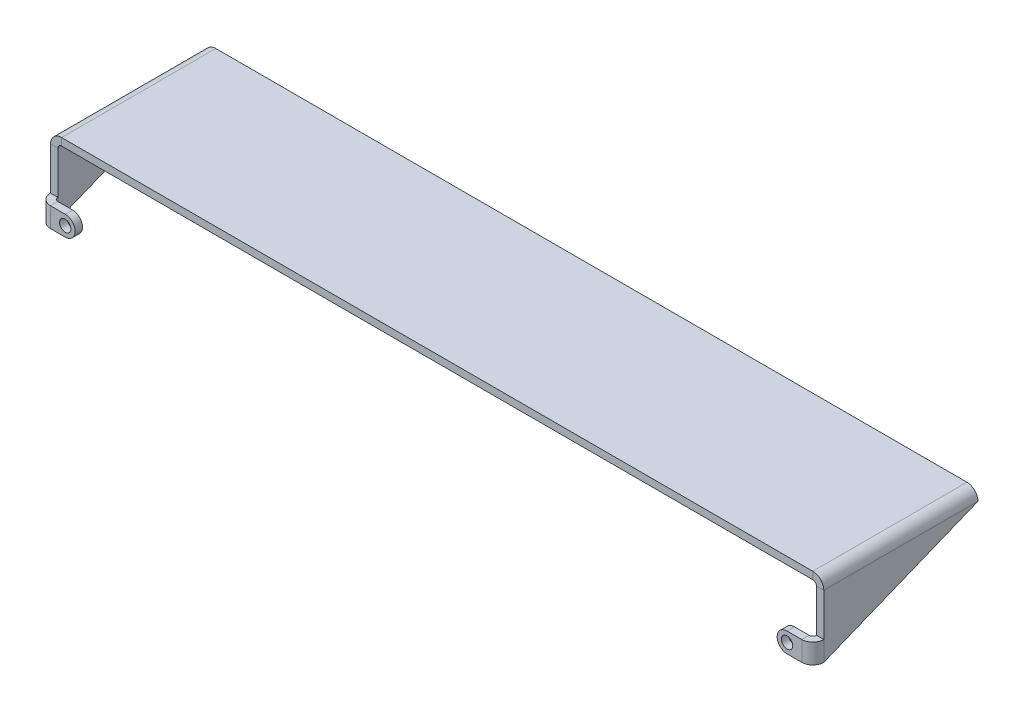
ISO-10303-21;
HEADER;
FILE_DESCRIPTION(('STEP AP214'),'2;1');
FILE_NAME('part.step','',(''),(''),'','','');
FILE_SCHEMA(('AUTOMOTIVE_DESIGN { 1 0 10303 214 1 1 1 1 }'));
ENDSEC;
DATA;
#1=APPLICATION_CONTEXT('core data for automotive mechanical design processes');
#2=APPLICATION_PROTOCOL_DEFINITION('international standard','automotive_design',2000,#1);
#3=PRODUCT_CONTEXT('',#1,'mechanical');
#4=PRODUCT('Part','Part','',(#3));
#5=PRODUCT_RELATED_PRODUCT_CATEGORY('part','',(#4));
#6=PRODUCT_DEFINITION_FORMATION('','',#4);
#7=PRODUCT_DEFINITION_CONTEXT('part definition',#1,'design');
#8=PRODUCT_DEFINITION('design','',#6,#7);
#9=PRODUCT_DEFINITION_SHAPE('','',#8);
#10=(LENGTH_UNIT() NAMED_UNIT(*) SI_UNIT(.MILLI.,.METRE.));
#11=(NAMED_UNIT(*) PLANE_ANGLE_UNIT() SI_UNIT($,.RADIAN.));
#12=(NAMED_UNIT(*) SI_UNIT($,.STERADIAN.) SOLID_ANGLE_UNIT());
#13=UNCERTAINTY_MEASURE_WITH_UNIT(LENGTH_MEASURE(1.E-05),#10,'distance_accuracy_value','');
#14=(GEOMETRIC_REPRESENTATION_CONTEXT(3) GLOBAL_UNCERTAINTY_ASSIGNED_CONTEXT((#13)) GLOBAL_UNIT_ASSIGNED_CONTEXT((#10,
#11,#12)) REPRESENTATION_CONTEXT('',''));
#15=CARTESIAN_POINT('',(0.,0.,0.));
#16=DIRECTION('',(0.,0.,1.));
#17=DIRECTION('',(1.,0.,0.));
#18=AXIS2_PLACEMENT_3D('',#15,#16,#17);
#19=CARTESIAN_POINT('',(-105.3,4.12908256056259E-13,0.));
#20=DIRECTION('',(-1.,0.,0.));
#21=DIRECTION('',(0.,-1.,0.));
#22=AXIS2_PLACEMENT_3D('',#19,#20,#21);
#23=PLANE('',#22);
#24=DIRECTION('',(0.,0.,-1.));
#25=VECTOR('',#24,1.);
#26=CARTESIAN_POINT('',(-105.3,-2.99999999999999,0.));
#27=LINE('',#26,#25);
#28=CARTESIAN_POINT('',(-105.3,-3.00000000000025,19.5));
#29=VERTEX_POINT('',#28);
#30=CARTESIAN_POINT('',(-105.3,-3.00000000000024,-22.5));
#31=VERTEX_POINT('',#30);
#32=EDGE_CURVE('E327',#29,#31,#27,.T.);
#33=ORIENTED_EDGE('',*,*,#32,.T.);
#34=DIRECTION('',(0.,0.375192757733183,-0.926946813223158));
#35=VECTOR('',#34,1.);
#36=CARTESIAN_POINT('',(-105.3,-10.4028251339505,-4.21066731612298));
#37=LINE('',#36,#35);
#38=CARTESIAN_POINT('',(-105.3,-20.,19.4999999999994));
#39=VERTEX_POINT('',#38);
#40=EDGE_CURVE('E427',#39,#31,#37,.T.);
#41=ORIENTED_EDGE('',*,*,#40,.F.);
#42=DIRECTION('',(0.,-1.,0.));
#43=VECTOR('',#42,1.);
#44=CARTESIAN_POINT('',(-105.3,-20.,19.5));
#45=LINE('',#44,#43);
#46=CARTESIAN_POINT('',(-105.3,-14.6000000000003,19.5));
#47=VERTEX_POINT('',#46);
#48=EDGE_CURVE('E496',#39,#47,#45,.F.);
#49=ORIENTED_EDGE('',*,*,#48,.T.);
#50=DIRECTION('',(0.,-1.,0.));
#51=VECTOR('',#50,1.);
#52=CARTESIAN_POINT('',(-105.3,-20.,19.5));
#53=LINE('',#52,#51);
#54=EDGE_CURVE('E922',#47,#29,#53,.F.);
#55=ORIENTED_EDGE('',*,*,#54,.T.);
#56=EDGE_LOOP('',(#33,#41,#49,#55));
#57=FACE_BOUND('',#56,.T.);
#58=ADVANCED_FACE('F123',(#57),#23,.T.);
#59=CARTESIAN_POINT('',(-103.3,4.05925293378573E-13,0.));
#60=DIRECTION('',(-1.,0.,0.));
#61=DIRECTION('',(0.,-1.,0.));
#62=AXIS2_PLACEMENT_3D('',#59,#60,#61);
#63=PLANE('',#62);
#64=DIRECTION('',(0.,0.375192757733183,-0.926946813223158));
#65=VECTOR('',#64,1.);
#66=CARTESIAN_POINT('',(-103.3,-10.4028251339505,-4.21066731612298));
#67=LINE('',#66,#65);
#68=CARTESIAN_POINT('',(-103.3,-20.,19.5));
#69=VERTEX_POINT('',#68);
#70=CARTESIAN_POINT('',(-103.3,-3.00000000000025,-22.5));
#71=VERTEX_POINT('',#70);
#72=EDGE_CURVE('E422',#69,#71,#67,.T.);
#73=ORIENTED_EDGE('',*,*,#72,.T.);
#74=DIRECTION('',(0.,0.,1.));
#75=VECTOR('',#74,1.);
#76=CARTESIAN_POINT('',(-103.3,-3.,22.5));
#77=LINE('',#76,#75);
#78=CARTESIAN_POINT('',(-103.3,-3.00000000000025,19.5));
#79=VERTEX_POINT('',#78);
#80=EDGE_CURVE('E326',#79,#71,#77,.F.);
#81=ORIENTED_EDGE('',*,*,#80,.F.);
#82=DIRECTION('',(0.,-1.,0.));
#83=VECTOR('',#82,1.);
#84=CARTESIAN_POINT('',(-103.3,-20.,19.5));
#85=LINE('',#84,#83);
#86=CARTESIAN_POINT('',(-103.3,-14.6000000000003,19.5));
#87=VERTEX_POINT('',#86);
#88=EDGE_CURVE('E276',#87,#79,#85,.F.);
#89=ORIENTED_EDGE('',*,*,#88,.F.);
#90=DIRECTION('',(0.,-1.,0.));
#91=VECTOR('',#90,1.);
#92=CARTESIAN_POINT('',(-103.3,-20.,19.5));
#93=LINE('',#92,#91);
#94=EDGE_CURVE('E423',#69,#87,#93,.F.);
#95=ORIENTED_EDGE('',*,*,#94,.F.);
#96=EDGE_LOOP('',(#73,#81,#89,#95));
#97=FACE_BOUND('',#96,.T.);
#98=ADVANCED_FACE('F419',(#97),#63,.F.);
#99=CARTESIAN_POINT('',(105.3,4.12908256056259E-13,0.));
#100=DIRECTION('',(-1.,0.,0.));
#101=DIRECTION('',(0.,-1.,0.));
#102=AXIS2_PLACEMENT_3D('',#99,#100,#101);
#103=PLANE('',#102);
#104=DIRECTION('',(0.,0.375192757733183,-0.926946813223158));
#105=VECTOR('',#104,1.);
#106=CARTESIAN_POINT('',(105.3,-10.402825133951,-4.2106673161232));
#107=LINE('',#106,#105);
#108=CARTESIAN_POINT('',(105.3,-20.,19.5));
#109=VERTEX_POINT('',#108);
#110=CARTESIAN_POINT('',(105.3,-3.00000000000086,-22.5));
#111=VERTEX_POINT('',#110);
#112=EDGE_CURVE('E429',#109,#111,#107,.T.);
#113=ORIENTED_EDGE('',*,*,#112,.T.);
#114=DIRECTION('',(0.,0.,1.));
#115=VECTOR('',#114,1.);
#116=CARTESIAN_POINT('',(105.3,-2.99999999999999,-22.5));
#117=LINE('',#116,#115);
#118=CARTESIAN_POINT('',(105.3,-3.00000000000003,19.5));
#119=VERTEX_POINT('',#118);
#120=EDGE_CURVE('E292',#119,#111,#117,.F.);
#121=ORIENTED_EDGE('',*,*,#120,.F.);
#122=DIRECTION('',(0.,1.,0.));
#123=VECTOR('',#122,1.);
#124=CARTESIAN_POINT('',(105.3,-3.00000000000001,19.5));
#125=LINE('',#124,#123);
#126=CARTESIAN_POINT('',(105.3,-14.6000000000001,19.5));
#127=VERTEX_POINT('',#126);
#128=EDGE_CURVE('E272',#119,#127,#125,.F.);
#129=ORIENTED_EDGE('',*,*,#128,.T.);
#130=EDGE_CURVE('E280',#127,#109,#125,.F.);
#131=ORIENTED_EDGE('',*,*,#130,.T.);
#132=EDGE_LOOP('',(#113,#121,#129,#131));
#133=FACE_BOUND('',#132,.T.);
#134=ADVANCED_FACE('F290',(#133),#103,.F.);
#135=CARTESIAN_POINT('',(103.3,4.05925293378573E-13,0.));
#136=DIRECTION('',(-1.,0.,0.));
#137=DIRECTION('',(0.,-1.,0.));
#138=AXIS2_PLACEMENT_3D('',#135,#136,#137);
#139=PLANE('',#138);
#140=DIRECTION('',(0.,0.,1.));
#141=VECTOR('',#140,1.);
#142=CARTESIAN_POINT('',(103.3,-3.,-22.5));
#143=LINE('',#142,#141);
#144=CARTESIAN_POINT('',(103.3,-3.00000000000087,-22.5));
#145=VERTEX_POINT('',#144);
#146=CARTESIAN_POINT('',(103.3,-3.00000000000088,19.5));
#147=VERTEX_POINT('',#146);
#148=EDGE_CURVE('E310',#145,#147,#143,.T.);
#149=ORIENTED_EDGE('',*,*,#148,.F.);
#150=DIRECTION('',(0.,0.375192757733183,-0.926946813223158));
#151=VECTOR('',#150,1.);
#152=CARTESIAN_POINT('',(103.3,-10.402825133951,-4.2106673161232));
#153=LINE('',#152,#151);
#154=CARTESIAN_POINT('',(103.3,-20.,19.4999999999978));
#155=VERTEX_POINT('',#154);
#156=EDGE_CURVE('E426',#155,#145,#153,.T.);
#157=ORIENTED_EDGE('',*,*,#156,.F.);
#158=DIRECTION('',(0.,1.,0.));
#159=VECTOR('',#158,1.);
#160=CARTESIAN_POINT('',(103.3,-3.00000000000001,19.5));
#161=LINE('',#160,#159);
#162=CARTESIAN_POINT('',(103.3,-14.6000000000009,19.5));
#163=VERTEX_POINT('',#162);
#164=EDGE_CURVE('E303',#163,#155,#161,.F.);
#165=ORIENTED_EDGE('',*,*,#164,.F.);
#166=EDGE_CURVE('E275',#147,#163,#161,.F.);
#167=ORIENTED_EDGE('',*,*,#166,.F.);
#168=EDGE_LOOP('',(#149,#157,#165,#167));
#169=FACE_BOUND('',#168,.T.);
#170=ADVANCED_FACE('F400',(#169),#139,.T.);
#171=CARTESIAN_POINT('',(0.,-2.,0.));
#172=DIRECTION('',(0.,-1.,0.));
#173=DIRECTION('',(0.,0.,-1.));
#174=AXIS2_PLACEMENT_3D('',#171,#172,#173);
#175=PLANE('',#174);
#176=DIRECTION('',(0.,0.,1.));
#177=VECTOR('',#176,1.);
#178=CARTESIAN_POINT('',(102.3,-2.00000000000001,22.5));
#179=LINE('',#178,#177);
#180=CARTESIAN_POINT('',(102.3,-2.00000000000001,19.5));
#181=VERTEX_POINT('',#180);
#182=CARTESIAN_POINT('',(102.3,-2.00000000000001,-22.5));
#183=VERTEX_POINT('',#182);
#184=EDGE_CURVE('E309',#181,#183,#179,.F.);
#185=ORIENTED_EDGE('',*,*,#184,.F.);
#186=DIRECTION('',(-1.,0.,0.));
#187=VECTOR('',#186,1.);
#188=CARTESIAN_POINT('',(105.3,-2.,19.5));
#189=LINE('',#188,#187);
#190=CARTESIAN_POINT('',(-102.3,-2.,19.5));
#191=VERTEX_POINT('',#190);
#192=EDGE_CURVE('E408',#181,#191,#189,.T.);
#193=ORIENTED_EDGE('',*,*,#192,.T.);
#194=DIRECTION('',(0.,0.,-1.));
#195=VECTOR('',#194,1.);
#196=CARTESIAN_POINT('',(-102.3,-2.00000000000001,-22.5));
#197=LINE('',#196,#195);
#198=CARTESIAN_POINT('',(-102.3,-2.,-22.5));
#199=VERTEX_POINT('',#198);
#200=EDGE_CURVE('E343',#199,#191,#197,.F.);
#201=ORIENTED_EDGE('',*,*,#200,.F.);
#202=DIRECTION('',(-1.,0.,0.));
#203=VECTOR('',#202,1.);
#204=CARTESIAN_POINT('',(-105.3,-2.,-22.5));
#205=LINE('',#204,#203);
#206=EDGE_CURVE('E350',#183,#199,#205,.T.);
#207=ORIENTED_EDGE('',*,*,#206,.F.);
#208=EDGE_LOOP('',(#185,#193,#201,#207));
#209=FACE_BOUND('',#208,.T.);
#210=ADVANCED_FACE('F406',(#209),#175,.T.);
#211=CARTESIAN_POINT('',(0.,0.,0.));
#212=DIRECTION('',(0.,-1.,0.));
#213=DIRECTION('',(0.,0.,-1.));
#214=AXIS2_PLACEMENT_3D('',#211,#212,#213);
#215=PLANE('',#214);
#216=DIRECTION('',(1.,0.,0.));
#217=VECTOR('',#216,1.);
#218=CARTESIAN_POINT('',(0.,0.,19.5));
#219=LINE('',#218,#217);
#220=CARTESIAN_POINT('',(102.3,0.,19.5));
#221=VERTEX_POINT('',#220);
#222=CARTESIAN_POINT('',(-102.3,0.,19.5));
#223=VERTEX_POINT('',#222);
#224=EDGE_CURVE('E376',#221,#223,#219,.F.);
#225=ORIENTED_EDGE('',*,*,#224,.F.);
#226=DIRECTION('',(0.,0.,1.));
#227=VECTOR('',#226,1.);
#228=CARTESIAN_POINT('',(102.3,0.,22.5));
#229=LINE('',#228,#227);
#230=CARTESIAN_POINT('',(102.3,0.,-22.5));
#231=VERTEX_POINT('',#230);
#232=EDGE_CURVE('E314',#221,#231,#229,.F.);
#233=ORIENTED_EDGE('',*,*,#232,.T.);
#234=DIRECTION('',(-1.,0.,0.));
#235=VECTOR('',#234,1.);
#236=CARTESIAN_POINT('',(-105.3,0.,-22.5));
#237=LINE('',#236,#235);
#238=CARTESIAN_POINT('',(-102.3,0.,-22.5));
#239=VERTEX_POINT('',#238);
#240=EDGE_CURVE('E349',#231,#239,#237,.T.);
#241=ORIENTED_EDGE('',*,*,#240,.T.);
#242=DIRECTION('',(0.,0.,-1.));
#243=VECTOR('',#242,1.);
#244=CARTESIAN_POINT('',(-102.3,0.,-22.5));
#245=LINE('',#244,#243);
#246=EDGE_CURVE('E336',#239,#223,#245,.F.);
#247=ORIENTED_EDGE('',*,*,#246,.T.);
#248=EDGE_LOOP('',(#225,#233,#241,#247));
#249=FACE_BOUND('',#248,.T.);
#250=ADVANCED_FACE('F375',(#249),#215,.F.);
#251=CARTESIAN_POINT('',(102.3,-3.00000000000001,19.5000000000001));
#252=DIRECTION('',(0.,1.,0.));
#253=DIRECTION('',(0.,0.,1.));
#254=AXIS2_PLACEMENT_3D('',#251,#252,#253);
#255=CYLINDRICAL_SURFACE('',#254,3.00000000000001);
#256=ORIENTED_EDGE('',*,*,#130,.F.);
#257=CARTESIAN_POINT('',(102.3,-14.6000000000001,19.5000000000001));
#258=DIRECTION('',(0.,1.,0.));
#259=DIRECTION('',(0.,0.,1.));
#260=AXIS2_PLACEMENT_3D('',#257,#258,#259);
#261=CIRCLE('',#260,3.00000000000001);
#262=CARTESIAN_POINT('',(102.3,-14.6000000000001,22.5000000000001));
#263=VERTEX_POINT('',#262);
#264=EDGE_CURVE('E259',#263,#127,#261,.T.);
#265=ORIENTED_EDGE('',*,*,#264,.F.);
#266=DIRECTION('',(0.,1.,0.));
#267=VECTOR('',#266,1.);
#268=CARTESIAN_POINT('',(102.3,-20.,22.5000000000001));
#269=LINE('',#268,#267);
#270=CARTESIAN_POINT('',(102.3,-20.,22.5000000000001));
#271=VERTEX_POINT('',#270);
#272=EDGE_CURVE('E513',#263,#271,#269,.F.);
#273=ORIENTED_EDGE('',*,*,#272,.T.);
#274=CARTESIAN_POINT('',(102.3,-20.,19.5000000000001));
#275=DIRECTION('',(0.,1.,0.));
#276=DIRECTION('',(0.,0.,1.));
#277=AXIS2_PLACEMENT_3D('',#274,#275,#276);
#278=CIRCLE('',#277,3.00000000000001);
#279=EDGE_CURVE('E283',#109,#271,#278,.F.);
#280=ORIENTED_EDGE('',*,*,#279,.F.);
#281=EDGE_LOOP('',(#256,#265,#273,#280));
#282=FACE_BOUND('',#281,.T.);
#283=ADVANCED_FACE('F281',(#282),#255,.T.);
#284=CARTESIAN_POINT('',(102.3,-3.00000000000001,19.5000000000001));
#285=DIRECTION('',(0.,1.,0.));
#286=DIRECTION('',(0.,0.,1.));
#287=AXIS2_PLACEMENT_3D('',#284,#285,#286);
#288=CYLINDRICAL_SURFACE('',#287,1.00000000000001);
#289=CARTESIAN_POINT('',(102.3,-14.6000000000009,19.5000000000001));
#290=DIRECTION('',(0.,-1.,0.));
#291=DIRECTION('',(1.,0.,0.));
#292=AXIS2_PLACEMENT_3D('',#289,#290,#291);
#293=CIRCLE('',#292,1.00000000000001);
#294=CARTESIAN_POINT('',(102.3,-14.6000000000001,20.5000000000001));
#295=VERTEX_POINT('',#294);
#296=EDGE_CURVE('E138',#295,#163,#293,.F.);
#297=ORIENTED_EDGE('',*,*,#296,.T.);
#298=ORIENTED_EDGE('',*,*,#164,.T.);
#299=CARTESIAN_POINT('',(102.3,-20.,19.5000000000001));
#300=DIRECTION('',(0.,1.,0.));
#301=DIRECTION('',(0.,0.,1.));
#302=AXIS2_PLACEMENT_3D('',#299,#300,#301);
#303=CIRCLE('',#302,1.00000000000001);
#304=CARTESIAN_POINT('',(102.3,-20.,20.5000000000001));
#305=VERTEX_POINT('',#304);
#306=EDGE_CURVE('E287',#155,#305,#303,.F.);
#307=ORIENTED_EDGE('',*,*,#306,.T.);
#308=DIRECTION('',(0.,1.,0.));
#309=VECTOR('',#308,1.);
#310=CARTESIAN_POINT('',(102.3,-20.,20.5000000000001));
#311=LINE('',#310,#309);
#312=EDGE_CURVE('E514',#305,#295,#311,.T.);
#313=ORIENTED_EDGE('',*,*,#312,.T.);
#314=EDGE_LOOP('',(#297,#298,#307,#313));
#315=FACE_BOUND('',#314,.T.);
#316=ADVANCED_FACE('F527',(#315),#288,.F.);
#317=CARTESIAN_POINT('',(-102.3,-20.,19.5));
#318=DIRECTION('',(0.,-1.,0.));
#319=DIRECTION('',(0.,0.,1.));
#320=AXIS2_PLACEMENT_3D('',#317,#318,#319);
#321=CYLINDRICAL_SURFACE('',#320,3.);
#322=DIRECTION('',(0.,-1.,0.));
#323=VECTOR('',#322,1.);
#324=CARTESIAN_POINT('',(-102.3,-3.00000000000002,22.5));
#325=LINE('',#324,#323);
#326=CARTESIAN_POINT('',(-102.3,-20.,22.5));
#327=VERTEX_POINT('',#326);
#328=CARTESIAN_POINT('',(-102.3,-14.6,22.5));
#329=VERTEX_POINT('',#328);
#330=EDGE_CURVE('E489',#327,#329,#325,.F.);
#331=ORIENTED_EDGE('',*,*,#330,.T.);
#332=CARTESIAN_POINT('',(-102.3,-14.6000000000003,19.5));
#333=DIRECTION('',(0.,-1.,0.));
#334=DIRECTION('',(0.,0.,-1.));
#335=AXIS2_PLACEMENT_3D('',#332,#333,#334);
#336=CIRCLE('',#335,3.);
#337=EDGE_CURVE('E918',#47,#329,#336,.F.);
#338=ORIENTED_EDGE('',*,*,#337,.F.);
#339=ORIENTED_EDGE('',*,*,#48,.F.);
#340=CARTESIAN_POINT('',(-102.3,-20.,19.5));
#341=DIRECTION('',(0.,-1.,0.));
#342=DIRECTION('',(0.,0.,-1.));
#343=AXIS2_PLACEMENT_3D('',#340,#341,#342);
#344=CIRCLE('',#343,3.);
#345=EDGE_CURVE('E500',#327,#39,#344,.T.);
#346=ORIENTED_EDGE('',*,*,#345,.F.);
#347=EDGE_LOOP('',(#331,#338,#339,#346));
#348=FACE_BOUND('',#347,.T.);
#349=ADVANCED_FACE('F653',(#348),#321,.T.);
#350=CARTESIAN_POINT('',(-102.3,-20.,19.5));
#351=DIRECTION('',(0.,-1.,0.));
#352=DIRECTION('',(0.,0.,1.));
#353=AXIS2_PLACEMENT_3D('',#350,#351,#352);
#354=CYLINDRICAL_SURFACE('',#353,1.);
#355=CARTESIAN_POINT('',(-102.3,-14.6000000000003,19.5));
#356=DIRECTION('',(0.,1.,-1.55520992810718E-13));
#357=DIRECTION('',(0.,1.55520992810718E-13,1.));
#358=AXIS2_PLACEMENT_3D('',#355,#356,#357);
#359=CIRCLE('',#358,1.);
#360=CARTESIAN_POINT('',(-102.3,-14.6,20.5));
#361=VERTEX_POINT('',#360);
#362=EDGE_CURVE('E431',#87,#361,#359,.T.);
#363=ORIENTED_EDGE('',*,*,#362,.T.);
#364=DIRECTION('',(0.,-1.,0.));
#365=VECTOR('',#364,1.);
#366=CARTESIAN_POINT('',(-102.3,-3.00000000000002,20.5));
#367=LINE('',#366,#365);
#368=CARTESIAN_POINT('',(-102.3,-20.,20.5));
#369=VERTEX_POINT('',#368);
#370=EDGE_CURVE('E479',#361,#369,#367,.T.);
#371=ORIENTED_EDGE('',*,*,#370,.T.);
#372=CARTESIAN_POINT('',(-102.3,-20.,19.5));
#373=DIRECTION('',(0.,-1.,0.));
#374=DIRECTION('',(0.,0.,-1.));
#375=AXIS2_PLACEMENT_3D('',#372,#373,#374);
#376=CIRCLE('',#375,1.);
#377=EDGE_CURVE('E485',#369,#69,#376,.T.);
#378=ORIENTED_EDGE('',*,*,#377,.T.);
#379=ORIENTED_EDGE('',*,*,#94,.T.);
#380=EDGE_LOOP('',(#363,#371,#378,#379));
#381=FACE_BOUND('',#380,.T.);
#382=ADVANCED_FACE('F648',(#381),#354,.F.);
#383=CARTESIAN_POINT('',(103.3,-20.,22.5000000000001));
#384=DIRECTION('',(0.,1.,0.));
#385=DIRECTION('',(-1.,0.,0.));
#386=AXIS2_PLACEMENT_3D('',#383,#384,#385);
#387=PLANE('',#386);
#388=DIRECTION('',(0.,0.,1.));
#389=VECTOR('',#388,1.);
#390=CARTESIAN_POINT('',(98.3000000000001,-20.,20.5000000000001));
#391=LINE('',#390,#389);
#392=CARTESIAN_POINT('',(98.3000000000001,-20.,22.5000000000001));
#393=VERTEX_POINT('',#392);
#394=CARTESIAN_POINT('',(98.3000000000001,-20.,20.5000000000001));
#395=VERTEX_POINT('',#394);
#396=EDGE_CURVE('E475',#393,#395,#391,.F.);
#397=ORIENTED_EDGE('',*,*,#396,.T.);
#398=DIRECTION('',(-1.,0.,0.));
#399=VECTOR('',#398,1.);
#400=CARTESIAN_POINT('',(103.3,-20.,20.5000000000001));
#401=LINE('',#400,#399);
#402=EDGE_CURVE('E511',#395,#305,#401,.F.);
#403=ORIENTED_EDGE('',*,*,#402,.T.);
#404=DIRECTION('',(0.,0.,-1.));
#405=VECTOR('',#404,1.);
#406=CARTESIAN_POINT('',(102.3,-20.,22.5000000000001));
#407=LINE('',#406,#405);
#408=EDGE_CURVE('E297',#305,#271,#407,.F.);
#409=ORIENTED_EDGE('',*,*,#408,.T.);
#410=DIRECTION('',(1.,0.,0.));
#411=VECTOR('',#410,1.);
#412=CARTESIAN_POINT('',(1.68312245943532E-13,-20.0000000000004,22.5000000000004));
#413=LINE('',#412,#411);
#414=EDGE_CURVE('E509',#393,#271,#413,.T.);
#415=ORIENTED_EDGE('',*,*,#414,.F.);
#416=EDGE_LOOP('',(#397,#403,#409,#415));
#417=FACE_BOUND('',#416,.T.);
#418=ADVANCED_FACE('F522',(#417),#387,.F.);
#419=CARTESIAN_POINT('',(0.,0.,22.5000000000004));
#420=DIRECTION('',(0.,0.,-1.));
#421=DIRECTION('',(-1.,0.,0.));
#422=AXIS2_PLACEMENT_3D('',#419,#420,#421);
#423=PLANE('',#422);
#424=CARTESIAN_POINT('',(98.3000000000001,-17.3,22.5000000000001));
#425=DIRECTION('',(0.,0.,-1.));
#426=DIRECTION('',(-1.,0.,0.));
#427=AXIS2_PLACEMENT_3D('',#424,#425,#426);
#428=CIRCLE('',#427,2.7);
#429=CARTESIAN_POINT('',(98.3000000000001,-14.6,22.5000000000001));
#430=VERTEX_POINT('',#429);
#431=EDGE_CURVE('E456',#393,#430,#428,.T.);
#432=ORIENTED_EDGE('',*,*,#431,.F.);
#433=ORIENTED_EDGE('',*,*,#414,.T.);
#434=ORIENTED_EDGE('',*,*,#272,.F.);
#435=DIRECTION('',(1.,0.,0.));
#436=VECTOR('',#435,1.);
#437=CARTESIAN_POINT('',(97.8,-14.6,22.5000000000001));
#438=LINE('',#437,#436);
#439=EDGE_CURVE('E469',#430,#263,#438,.T.);
#440=ORIENTED_EDGE('',*,*,#439,.F.);
#441=EDGE_LOOP('',(#432,#433,#434,#440));
#442=FACE_BOUND('',#441,.T.);
#443=CARTESIAN_POINT('',(98.3000000000001,-17.3,22.5000000000001));
#444=DIRECTION('',(0.,0.,-1.));
#445=DIRECTION('',(1.,0.,0.));
#446=AXIS2_PLACEMENT_3D('',#443,#444,#445);
#447=CIRCLE('',#446,1.54999999999999);
#448=CARTESIAN_POINT('',(99.8500000000001,-17.3,22.5000000000001));
#449=VERTEX_POINT('',#448);
#450=EDGE_CURVE('E453',#449,#449,#447,.T.);
#451=ORIENTED_EDGE('',*,*,#450,.T.);
#452=EDGE_LOOP('',(#451));
#453=FACE_BOUND('',#452,.T.);
#454=ADVANCED_FACE('F539',(#442,#453),#423,.F.);
#455=CARTESIAN_POINT('',(0.,0.,20.5000000000004));
#456=DIRECTION('',(0.,0.,-1.));
#457=DIRECTION('',(-1.,0.,0.));
#458=AXIS2_PLACEMENT_3D('',#455,#456,#457);
#459=PLANE('',#458);
#460=ORIENTED_EDGE('',*,*,#402,.F.);
#461=CARTESIAN_POINT('',(98.3000000000001,-17.3,20.5000000000001));
#462=DIRECTION('',(0.,0.,-1.));
#463=DIRECTION('',(-1.,0.,0.));
#464=AXIS2_PLACEMENT_3D('',#461,#462,#463);
#465=CIRCLE('',#464,2.7);
#466=CARTESIAN_POINT('',(98.3000000000001,-14.6,20.5000000000001));
#467=VERTEX_POINT('',#466);
#468=EDGE_CURVE('E465',#395,#467,#465,.T.);
#469=ORIENTED_EDGE('',*,*,#468,.T.);
#470=DIRECTION('',(1.,0.,0.));
#471=VECTOR('',#470,1.);
#472=CARTESIAN_POINT('',(0.,-14.6000000000001,20.5000000000004));
#473=LINE('',#472,#471);
#474=EDGE_CURVE('E468',#467,#295,#473,.T.);
#475=ORIENTED_EDGE('',*,*,#474,.T.);
#476=ORIENTED_EDGE('',*,*,#312,.F.);
#477=EDGE_LOOP('',(#460,#469,#475,#476));
#478=FACE_BOUND('',#477,.T.);
#479=CARTESIAN_POINT('',(98.3000000000001,-17.3,20.5000000000001));
#480=DIRECTION('',(0.,0.,-1.));
#481=DIRECTION('',(-1.,0.,0.));
#482=AXIS2_PLACEMENT_3D('',#479,#480,#481);
#483=CIRCLE('',#482,1.54999999999999);
#484=CARTESIAN_POINT('',(96.7500000000001,-17.3,20.5000000000001));
#485=VERTEX_POINT('',#484);
#486=EDGE_CURVE('E457',#485,#485,#483,.T.);
#487=ORIENTED_EDGE('',*,*,#486,.F.);
#488=EDGE_LOOP('',(#487));
#489=FACE_BOUND('',#488,.T.);
#490=ADVANCED_FACE('F529',(#478,#489),#459,.T.);
#491=CARTESIAN_POINT('',(0.,0.,22.5000000000004));
#492=DIRECTION('',(0.,0.,-1.));
#493=DIRECTION('',(-1.,0.,0.));
#494=AXIS2_PLACEMENT_3D('',#491,#492,#493);
#495=PLANE('',#494);
#496=DIRECTION('',(1.,0.,0.));
#497=VECTOR('',#496,1.);
#498=CARTESIAN_POINT('',(-97.8,-14.6,22.5));
#499=LINE('',#498,#497);
#500=CARTESIAN_POINT('',(-98.2999999999999,-14.6,22.5));
#501=VERTEX_POINT('',#500);
#502=EDGE_CURVE('E436',#329,#501,#499,.T.);
#503=ORIENTED_EDGE('',*,*,#502,.F.);
#504=ORIENTED_EDGE('',*,*,#330,.F.);
#505=DIRECTION('',(1.,0.,0.));
#506=VECTOR('',#505,1.);
#507=CARTESIAN_POINT('',(-1.68312245943532E-13,-20.0000000000004,22.5000000000004));
#508=LINE('',#507,#506);
#509=CARTESIAN_POINT('',(-98.3,-20.,22.5));
#510=VERTEX_POINT('',#509);
#511=EDGE_CURVE('E482',#327,#510,#508,.T.);
#512=ORIENTED_EDGE('',*,*,#511,.T.);
#513=CARTESIAN_POINT('',(-98.2999999999999,-17.3,22.5));
#514=DIRECTION('',(0.,0.,-1.));
#515=DIRECTION('',(-1.,0.,0.));
#516=AXIS2_PLACEMENT_3D('',#513,#514,#515);
#517=CIRCLE('',#516,2.7);
#518=EDGE_CURVE('E442',#501,#510,#517,.T.);
#519=ORIENTED_EDGE('',*,*,#518,.F.);
#520=EDGE_LOOP('',(#503,#504,#512,#519));
#521=FACE_BOUND('',#520,.T.);
#522=CARTESIAN_POINT('',(-98.2999999999999,-17.3,22.5));
#523=DIRECTION('',(0.,0.,-1.));
#524=DIRECTION('',(1.,0.,0.));
#525=AXIS2_PLACEMENT_3D('',#522,#523,#524);
#526=CIRCLE('',#525,1.54999999999999);
#527=CARTESIAN_POINT('',(-96.7499999999999,-17.3,22.5));
#528=VERTEX_POINT('',#527);
#529=EDGE_CURVE('E460',#528,#528,#526,.T.);
#530=ORIENTED_EDGE('',*,*,#529,.T.);
#531=EDGE_LOOP('',(#530));
#532=FACE_BOUND('',#531,.T.);
#533=ADVANCED_FACE('F552',(#521,#532),#495,.F.);
#534=CARTESIAN_POINT('',(0.,0.,20.5000000000004));
#535=DIRECTION('',(0.,0.,-1.));
#536=DIRECTION('',(-1.,0.,0.));
#537=AXIS2_PLACEMENT_3D('',#534,#535,#536);
#538=PLANE('',#537);
#539=ORIENTED_EDGE('',*,*,#370,.F.);
#540=DIRECTION('',(1.,0.,0.));
#541=VECTOR('',#540,1.);
#542=CARTESIAN_POINT('',(0.,-14.6,20.5000000000004));
#543=LINE('',#542,#541);
#544=CARTESIAN_POINT('',(-98.2999999999999,-14.6,20.5));
#545=VERTEX_POINT('',#544);
#546=EDGE_CURVE('E438',#361,#545,#543,.T.);
#547=ORIENTED_EDGE('',*,*,#546,.T.);
#548=CARTESIAN_POINT('',(-98.2999999999999,-17.3,20.5));
#549=DIRECTION('',(0.,0.,-1.));
#550=DIRECTION('',(-1.,0.,0.));
#551=AXIS2_PLACEMENT_3D('',#548,#549,#550);
#552=CIRCLE('',#551,2.7);
#553=CARTESIAN_POINT('',(-98.2999999999999,-20.,20.5));
#554=VERTEX_POINT('',#553);
#555=EDGE_CURVE('E441',#545,#554,#552,.T.);
#556=ORIENTED_EDGE('',*,*,#555,.T.);
#557=DIRECTION('',(-1.,0.,0.));
#558=VECTOR('',#557,1.);
#559=CARTESIAN_POINT('',(-93.3000000000001,-20.,20.5));
#560=LINE('',#559,#558);
#561=EDGE_CURVE('E486',#369,#554,#560,.F.);
#562=ORIENTED_EDGE('',*,*,#561,.F.);
#563=EDGE_LOOP('',(#539,#547,#556,#562));
#564=FACE_BOUND('',#563,.T.);
#565=CARTESIAN_POINT('',(-98.2999999999999,-17.3,20.5));
#566=DIRECTION('',(0.,0.,-1.));
#567=DIRECTION('',(-1.,0.,0.));
#568=AXIS2_PLACEMENT_3D('',#565,#566,#567);
#569=CIRCLE('',#568,1.54999999999999);
#570=CARTESIAN_POINT('',(-99.8499999999999,-17.3,20.5));
#571=VERTEX_POINT('',#570);
#572=EDGE_CURVE('E450',#571,#571,#569,.T.);
#573=ORIENTED_EDGE('',*,*,#572,.F.);
#574=EDGE_LOOP('',(#573));
#575=FACE_BOUND('',#574,.T.);
#576=ADVANCED_FACE('F557',(#564,#575),#538,.T.);
#577=CARTESIAN_POINT('',(-102.3,-3.00000000000001,-22.5));
#578=DIRECTION('',(0.,0.,-1.));
#579=DIRECTION('',(-1.,0.,0.));
#580=AXIS2_PLACEMENT_3D('',#577,#578,#579);
#581=CYLINDRICAL_SURFACE('',#580,3.);
#582=ORIENTED_EDGE('',*,*,#32,.F.);
#583=CARTESIAN_POINT('',(-102.3,-3.00000000000001,19.5));
#584=DIRECTION('',(0.,0.,1.));
#585=DIRECTION('',(1.,0.,0.));
#586=AXIS2_PLACEMENT_3D('',#583,#584,#585);
#587=CIRCLE('',#586,3.);
#588=EDGE_CURVE('E131',#29,#223,#587,.F.);
#589=ORIENTED_EDGE('',*,*,#588,.T.);
#590=ORIENTED_EDGE('',*,*,#246,.F.);
#591=CARTESIAN_POINT('',(-102.3,-3.00000000000001,-22.5));
#592=DIRECTION('',(0.,0.,-1.));
#593=DIRECTION('',(-1.,0.,0.));
#594=AXIS2_PLACEMENT_3D('',#591,#592,#593);
#595=CIRCLE('',#594,3.);
#596=EDGE_CURVE('E340',#31,#239,#595,.T.);
#597=ORIENTED_EDGE('',*,*,#596,.F.);
#598=EDGE_LOOP('',(#582,#589,#590,#597));
#599=FACE_BOUND('',#598,.T.);
#600=ADVANCED_FACE('F369',(#599),#581,.T.);
#601=CARTESIAN_POINT('',(-102.3,-3.00000000000001,19.5));
#602=DIRECTION('',(0.,0.,1.));
#603=DIRECTION('',(1.,0.,0.));
#604=AXIS2_PLACEMENT_3D('',#601,#602,#603);
#605=PLANE('',#604);
#606=CARTESIAN_POINT('',(-102.3,-3.00000000000001,19.5));
#607=DIRECTION('',(0.,0.,1.));
#608=DIRECTION('',(1.,0.,0.));
#609=AXIS2_PLACEMENT_3D('',#606,#607,#608);
#610=CIRCLE('',#609,1.);
#611=EDGE_CURVE('E362',#79,#191,#610,.F.);
#612=ORIENTED_EDGE('',*,*,#611,.T.);
#613=DIRECTION('',(0.,1.,0.));
#614=VECTOR('',#613,1.);
#615=CARTESIAN_POINT('',(-102.3,-2.00000000000001,19.5));
#616=LINE('',#615,#614);
#617=EDGE_CURVE('E13',#191,#223,#616,.T.);
#618=ORIENTED_EDGE('',*,*,#617,.T.);
#619=ORIENTED_EDGE('',*,*,#588,.F.);
#620=DIRECTION('',(-1.,0.,0.));
#621=VECTOR('',#620,1.);
#622=CARTESIAN_POINT('',(-103.3,-3.,19.5));
#623=LINE('',#622,#621);
#624=EDGE_CURVE('E506',#79,#29,#623,.T.);
#625=ORIENTED_EDGE('',*,*,#624,.F.);
#626=EDGE_LOOP('',(#612,#618,#619,#625));
#627=FACE_BOUND('',#626,.T.);
#628=ADVANCED_FACE('F125',(#627),#605,.T.);
#629=CARTESIAN_POINT('',(102.3,-3.00000000000001,22.5));
#630=DIRECTION('',(0.,0.,1.));
#631=DIRECTION('',(1.,0.,0.));
#632=AXIS2_PLACEMENT_3D('',#629,#630,#631);
#633=CYLINDRICAL_SURFACE('',#632,3.);
#634=ORIENTED_EDGE('',*,*,#232,.F.);
#635=CARTESIAN_POINT('',(102.3,-3.00000000000001,19.5));
#636=DIRECTION('',(0.,0.,1.));
#637=DIRECTION('',(1.,0.,0.));
#638=AXIS2_PLACEMENT_3D('',#635,#636,#637);
#639=CIRCLE('',#638,3.);
#640=EDGE_CURVE('E352',#221,#119,#639,.F.);
#641=ORIENTED_EDGE('',*,*,#640,.T.);
#642=ORIENTED_EDGE('',*,*,#120,.T.);
#643=CARTESIAN_POINT('',(102.3,-3.00000000000001,-22.5));
#644=DIRECTION('',(0.,0.,1.));
#645=DIRECTION('',(1.,0.,0.));
#646=AXIS2_PLACEMENT_3D('',#643,#644,#645);
#647=CIRCLE('',#646,3.);
#648=EDGE_CURVE('E316',#231,#111,#647,.F.);
#649=ORIENTED_EDGE('',*,*,#648,.F.);
#650=EDGE_LOOP('',(#634,#641,#642,#649));
#651=FACE_BOUND('',#650,.T.);
#652=ADVANCED_FACE('F391',(#651),#633,.T.);
#653=CARTESIAN_POINT('',(-105.3,-2.,-22.5));
#654=DIRECTION('',(0.,0.,-1.));
#655=DIRECTION('',(-1.,0.,0.));
#656=AXIS2_PLACEMENT_3D('',#653,#654,#655);
#657=PLANE('',#656);
#658=DIRECTION('',(0.,1.,0.));
#659=VECTOR('',#658,1.);
#660=CARTESIAN_POINT('',(102.3,-2.00000000000001,-22.5));
#661=LINE('',#660,#659);
#662=EDGE_CURVE('E320',#183,#231,#661,.T.);
#663=ORIENTED_EDGE('',*,*,#662,.F.);
#664=ORIENTED_EDGE('',*,*,#206,.T.);
#665=DIRECTION('',(0.,1.,0.));
#666=VECTOR('',#665,1.);
#667=CARTESIAN_POINT('',(-102.3,-2.00000000000001,-22.5));
#668=LINE('',#667,#666);
#669=EDGE_CURVE('E339',#199,#239,#668,.T.);
#670=ORIENTED_EDGE('',*,*,#669,.T.);
#671=ORIENTED_EDGE('',*,*,#240,.F.);
#672=EDGE_LOOP('',(#663,#664,#670,#671));
#673=FACE_BOUND('',#672,.T.);
#674=ADVANCED_FACE('F382',(#673),#657,.T.);
#675=CARTESIAN_POINT('',(-102.3,-3.00000000000001,-22.5));
#676=DIRECTION('',(0.,0.,1.));
#677=DIRECTION('',(1.,0.,0.));
#678=AXIS2_PLACEMENT_3D('',#675,#676,#677);
#679=PLANE('',#678);
#680=CARTESIAN_POINT('',(-102.3,-3.00000000000001,-22.5));
#681=DIRECTION('',(0.,0.,-1.));
#682=DIRECTION('',(-1.,0.,0.));
#683=AXIS2_PLACEMENT_3D('',#680,#681,#682);
#684=CIRCLE('',#683,1.);
#685=EDGE_CURVE('E330',#71,#199,#684,.T.);
#686=ORIENTED_EDGE('',*,*,#685,.F.);
#687=DIRECTION('',(-1.,0.,0.));
#688=VECTOR('',#687,1.);
#689=CARTESIAN_POINT('',(-103.3,-3.,-22.5));
#690=LINE('',#689,#688);
#691=EDGE_CURVE('E331',#71,#31,#690,.T.);
#692=ORIENTED_EDGE('',*,*,#691,.T.);
#693=ORIENTED_EDGE('',*,*,#596,.T.);
#694=ORIENTED_EDGE('',*,*,#669,.F.);
#695=EDGE_LOOP('',(#686,#692,#693,#694));
#696=FACE_BOUND('',#695,.T.);
#697=ADVANCED_FACE('F413',(#696),#679,.F.);
#698=CARTESIAN_POINT('',(-102.3,-3.00000000000001,-22.5));
#699=DIRECTION('',(0.,0.,-1.));
#700=DIRECTION('',(-1.,0.,0.));
#701=AXIS2_PLACEMENT_3D('',#698,#699,#700);
#702=CYLINDRICAL_SURFACE('',#701,1.);
#703=ORIENTED_EDGE('',*,*,#611,.F.);
#704=ORIENTED_EDGE('',*,*,#80,.T.);
#705=ORIENTED_EDGE('',*,*,#685,.T.);
#706=ORIENTED_EDGE('',*,*,#200,.T.);
#707=EDGE_LOOP('',(#703,#704,#705,#706));
#708=FACE_BOUND('',#707,.T.);
#709=ADVANCED_FACE('F414',(#708),#702,.F.);
#710=CARTESIAN_POINT('',(102.3,-3.00000000000001,-22.5));
#711=DIRECTION('',(0.,0.,-1.));
#712=DIRECTION('',(-1.,0.,0.));
#713=AXIS2_PLACEMENT_3D('',#710,#711,#712);
#714=PLANE('',#713);
#715=DIRECTION('',(1.,0.,0.));
#716=VECTOR('',#715,1.);
#717=CARTESIAN_POINT('',(105.3,-2.99999999999999,-22.5));
#718=LINE('',#717,#716);
#719=EDGE_CURVE('E306',#145,#111,#718,.T.);
#720=ORIENTED_EDGE('',*,*,#719,.F.);
#721=CARTESIAN_POINT('',(102.3,-3.00000000000001,-22.5));
#722=DIRECTION('',(0.,0.,1.));
#723=DIRECTION('',(1.,0.,0.));
#724=AXIS2_PLACEMENT_3D('',#721,#722,#723);
#725=CIRCLE('',#724,1.);
#726=EDGE_CURVE('E317',#183,#145,#725,.F.);
#727=ORIENTED_EDGE('',*,*,#726,.F.);
#728=ORIENTED_EDGE('',*,*,#662,.T.);
#729=ORIENTED_EDGE('',*,*,#648,.T.);
#730=EDGE_LOOP('',(#720,#727,#728,#729));
#731=FACE_BOUND('',#730,.T.);
#732=ADVANCED_FACE('F389',(#731),#714,.T.);
#733=CARTESIAN_POINT('',(102.3,-3.00000000000001,19.5));
#734=DIRECTION('',(0.,0.,1.));
#735=DIRECTION('',(1.,0.,0.));
#736=AXIS2_PLACEMENT_3D('',#733,#734,#735);
#737=PLANE('',#736);
#738=ORIENTED_EDGE('',*,*,#640,.F.);
#739=DIRECTION('',(0.,-1.,0.));
#740=VECTOR('',#739,1.);
#741=CARTESIAN_POINT('',(102.3,0.,19.5));
#742=LINE('',#741,#740);
#743=EDGE_CURVE('E359',#221,#181,#742,.T.);
#744=ORIENTED_EDGE('',*,*,#743,.T.);
#745=CARTESIAN_POINT('',(102.3,-3.00000000000001,19.5));
#746=DIRECTION('',(0.,0.,1.));
#747=DIRECTION('',(1.,0.,0.));
#748=AXIS2_PLACEMENT_3D('',#745,#746,#747);
#749=CIRCLE('',#748,1.);
#750=EDGE_CURVE('E356',#181,#147,#749,.F.);
#751=ORIENTED_EDGE('',*,*,#750,.T.);
#752=DIRECTION('',(1.,0.,0.));
#753=VECTOR('',#752,1.);
#754=CARTESIAN_POINT('',(103.3,-3.00000000000003,19.5));
#755=LINE('',#754,#753);
#756=EDGE_CURVE('E294',#147,#119,#755,.T.);
#757=ORIENTED_EDGE('',*,*,#756,.T.);
#758=EDGE_LOOP('',(#738,#744,#751,#757));
#759=FACE_BOUND('',#758,.T.);
#760=ADVANCED_FACE('F393',(#759),#737,.T.);
#761=CARTESIAN_POINT('',(102.3,-3.00000000000001,22.5));
#762=DIRECTION('',(0.,0.,1.));
#763=DIRECTION('',(1.,0.,0.));
#764=AXIS2_PLACEMENT_3D('',#761,#762,#763);
#765=CYLINDRICAL_SURFACE('',#764,1.);
#766=ORIENTED_EDGE('',*,*,#750,.F.);
#767=ORIENTED_EDGE('',*,*,#184,.T.);
#768=ORIENTED_EDGE('',*,*,#726,.T.);
#769=ORIENTED_EDGE('',*,*,#148,.T.);
#770=EDGE_LOOP('',(#766,#767,#768,#769));
#771=FACE_BOUND('',#770,.T.);
#772=ADVANCED_FACE('F403',(#771),#765,.F.);
#773=CARTESIAN_POINT('',(102.3,-20.,19.5000000000001));
#774=DIRECTION('',(0.,-1.,0.));
#775=DIRECTION('',(0.,0.,-1.));
#776=AXIS2_PLACEMENT_3D('',#773,#774,#775);
#777=PLANE('',#776);
#778=ORIENTED_EDGE('',*,*,#408,.F.);
#779=ORIENTED_EDGE('',*,*,#306,.F.);
#780=DIRECTION('',(1.,0.,0.));
#781=VECTOR('',#780,1.);
#782=CARTESIAN_POINT('',(103.3,-20.,19.5));
#783=LINE('',#782,#781);
#784=EDGE_CURVE('E304',#155,#109,#783,.T.);
#785=ORIENTED_EDGE('',*,*,#784,.T.);
#786=ORIENTED_EDGE('',*,*,#279,.T.);
#787=EDGE_LOOP('',(#778,#779,#785,#786));
#788=FACE_BOUND('',#787,.T.);
#789=ADVANCED_FACE('F526',(#788),#777,.T.);
#790=CARTESIAN_POINT('',(-102.3,-20.,19.5));
#791=DIRECTION('',(0.,1.,0.));
#792=DIRECTION('',(0.,0.,1.));
#793=AXIS2_PLACEMENT_3D('',#790,#791,#792);
#794=PLANE('',#793);
#795=ORIENTED_EDGE('',*,*,#377,.F.);
#796=DIRECTION('',(0.,0.,-1.));
#797=VECTOR('',#796,1.);
#798=CARTESIAN_POINT('',(-102.3,-20.,20.5));
#799=LINE('',#798,#797);
#800=EDGE_CURVE('E492',#369,#327,#799,.F.);
#801=ORIENTED_EDGE('',*,*,#800,.T.);
#802=ORIENTED_EDGE('',*,*,#345,.T.);
#803=DIRECTION('',(-1.,0.,0.));
#804=VECTOR('',#803,1.);
#805=CARTESIAN_POINT('',(-103.3,-20.,19.5));
#806=LINE('',#805,#804);
#807=EDGE_CURVE('E499',#69,#39,#806,.T.);
#808=ORIENTED_EDGE('',*,*,#807,.F.);
#809=EDGE_LOOP('',(#795,#801,#802,#808));
#810=FACE_BOUND('',#809,.T.);
#811=ADVANCED_FACE('F774',(#810),#794,.F.);
#812=CARTESIAN_POINT('',(-93.3000000000001,-20.,22.5));
#813=DIRECTION('',(0.,1.,0.));
#814=DIRECTION('',(-1.,0.,0.));
#815=AXIS2_PLACEMENT_3D('',#812,#813,#814);
#816=PLANE('',#815);
#817=ORIENTED_EDGE('',*,*,#561,.T.);
#818=DIRECTION('',(0.,0.,1.));
#819=VECTOR('',#818,1.);
#820=CARTESIAN_POINT('',(-98.2999999999999,-20.,20.5));
#821=LINE('',#820,#819);
#822=EDGE_CURVE('E146',#510,#554,#821,.F.);
#823=ORIENTED_EDGE('',*,*,#822,.F.);
#824=ORIENTED_EDGE('',*,*,#511,.F.);
#825=ORIENTED_EDGE('',*,*,#800,.F.);
#826=EDGE_LOOP('',(#817,#823,#824,#825));
#827=FACE_BOUND('',#826,.T.);
#828=ADVANCED_FACE('F770',(#827),#816,.F.);
#829=CARTESIAN_POINT('',(0.,-14.6,20.5000000000004));
#830=DIRECTION('',(0.,-1.,0.));
#831=DIRECTION('',(1.,0.,0.));
#832=AXIS2_PLACEMENT_3D('',#829,#830,#831);
#833=PLANE('',#832);
#834=DIRECTION('',(0.,0.,1.));
#835=VECTOR('',#834,1.);
#836=CARTESIAN_POINT('',(-102.3,-14.6,20.5));
#837=LINE('',#836,#835);
#838=EDGE_CURVE('E447',#329,#361,#837,.F.);
#839=ORIENTED_EDGE('',*,*,#838,.F.);
#840=ORIENTED_EDGE('',*,*,#502,.T.);
#841=DIRECTION('',(0.,0.,1.));
#842=VECTOR('',#841,1.);
#843=CARTESIAN_POINT('',(-98.2999999999999,-14.6,20.5));
#844=LINE('',#843,#842);
#845=EDGE_CURVE('E444',#501,#545,#844,.F.);
#846=ORIENTED_EDGE('',*,*,#845,.T.);
#847=ORIENTED_EDGE('',*,*,#546,.F.);
#848=EDGE_LOOP('',(#839,#840,#846,#847));
#849=FACE_BOUND('',#848,.T.);
#850=ADVANCED_FACE('F762',(#849),#833,.F.);
#851=CARTESIAN_POINT('',(-98.2999999999999,-17.3,20.5));
#852=DIRECTION('',(0.,0.,1.));
#853=DIRECTION('',(1.,0.,0.));
#854=AXIS2_PLACEMENT_3D('',#851,#852,#853);
#855=CYLINDRICAL_SURFACE('',#854,2.7);
#856=ORIENTED_EDGE('',*,*,#518,.T.);
#857=ORIENTED_EDGE('',*,*,#822,.T.);
#858=ORIENTED_EDGE('',*,*,#555,.F.);
#859=ORIENTED_EDGE('',*,*,#845,.F.);
#860=EDGE_LOOP('',(#856,#857,#858,#859));
#861=FACE_BOUND('',#860,.T.);
#862=ADVANCED_FACE('F751',(#861),#855,.T.);
#863=CARTESIAN_POINT('',(-98.2999999999999,-17.3,22.5));
#864=DIRECTION('',(0.,0.,-1.));
#865=DIRECTION('',(-1.,0.,0.));
#866=AXIS2_PLACEMENT_3D('',#863,#864,#865);
#867=CYLINDRICAL_SURFACE('',#866,1.54999999999999);
#868=ORIENTED_EDGE('',*,*,#529,.F.);
#869=EDGE_LOOP('',(#868));
#870=FACE_BOUND('',#869,.T.);
#871=ORIENTED_EDGE('',*,*,#572,.T.);
#872=EDGE_LOOP('',(#871));
#873=FACE_BOUND('',#872,.T.);
#874=ADVANCED_FACE('F741',(#870,#873),#867,.F.);
#875=CARTESIAN_POINT('',(98.3000000000001,-17.3,20.5000000000001));
#876=DIRECTION('',(0.,0.,1.));
#877=DIRECTION('',(1.,0.,0.));
#878=AXIS2_PLACEMENT_3D('',#875,#876,#877);
#879=CYLINDRICAL_SURFACE('',#878,2.7);
#880=ORIENTED_EDGE('',*,*,#396,.F.);
#881=ORIENTED_EDGE('',*,*,#431,.T.);
#882=DIRECTION('',(0.,0.,1.));
#883=VECTOR('',#882,1.);
#884=CARTESIAN_POINT('',(98.3000000000001,-14.6,20.5000000000001));
#885=LINE('',#884,#883);
#886=EDGE_CURVE('E472',#430,#467,#885,.F.);
#887=ORIENTED_EDGE('',*,*,#886,.T.);
#888=ORIENTED_EDGE('',*,*,#468,.F.);
#889=EDGE_LOOP('',(#880,#881,#887,#888));
#890=FACE_BOUND('',#889,.T.);
#891=ADVANCED_FACE('F536',(#890),#879,.T.);
#892=CARTESIAN_POINT('',(0.,-14.6000000000001,20.5000000000004));
#893=DIRECTION('',(0.,-1.,0.));
#894=DIRECTION('',(1.,0.,0.));
#895=AXIS2_PLACEMENT_3D('',#892,#893,#894);
#896=PLANE('',#895);
#897=ORIENTED_EDGE('',*,*,#439,.T.);
#898=DIRECTION('',(0.,0.,1.));
#899=VECTOR('',#898,1.);
#900=CARTESIAN_POINT('',(102.3,-14.6000000000001,20.5));
#901=LINE('',#900,#899);
#902=EDGE_CURVE('E263',#263,#295,#901,.F.);
#903=ORIENTED_EDGE('',*,*,#902,.T.);
#904=ORIENTED_EDGE('',*,*,#474,.F.);
#905=ORIENTED_EDGE('',*,*,#886,.F.);
#906=EDGE_LOOP('',(#897,#903,#904,#905));
#907=FACE_BOUND('',#906,.T.);
#908=ADVANCED_FACE('F533',(#907),#896,.F.);
#909=CARTESIAN_POINT('',(98.3000000000001,-17.3,22.5000000000001));
#910=DIRECTION('',(0.,0.,-1.));
#911=DIRECTION('',(-1.,0.,0.));
#912=AXIS2_PLACEMENT_3D('',#909,#910,#911);
#913=CYLINDRICAL_SURFACE('',#912,1.54999999999999);
#914=ORIENTED_EDGE('',*,*,#450,.F.);
#915=EDGE_LOOP('',(#914));
#916=FACE_BOUND('',#915,.T.);
#917=ORIENTED_EDGE('',*,*,#486,.T.);
#918=EDGE_LOOP('',(#917));
#919=FACE_BOUND('',#918,.T.);
#920=ADVANCED_FACE('F546',(#916,#919),#913,.F.);
#921=CARTESIAN_POINT('',(103.3,-8.80000000000089,19.5));
#922=DIRECTION('',(0.,0.,-1.));
#923=DIRECTION('',(0.,1.,0.));
#924=AXIS2_PLACEMENT_3D('',#921,#922,#923);
#925=PLANE('',#924);
#926=ORIENTED_EDGE('',*,*,#756,.F.);
#927=ORIENTED_EDGE('',*,*,#166,.T.);
#928=DIRECTION('',(-1.,0.,0.));
#929=VECTOR('',#928,1.);
#930=CARTESIAN_POINT('',(103.3,-14.6000000000009,19.5));
#931=LINE('',#930,#929);
#932=EDGE_CURVE('E262',#163,#127,#931,.F.);
#933=ORIENTED_EDGE('',*,*,#932,.T.);
#934=ORIENTED_EDGE('',*,*,#128,.F.);
#935=EDGE_LOOP('',(#926,#927,#933,#934));
#936=FACE_BOUND('',#935,.T.);
#937=ADVANCED_FACE('F270',(#936),#925,.F.);
#938=CARTESIAN_POINT('',(102.3,-14.6000000000009,19.5000000000001));
#939=DIRECTION('',(0.,1.,0.));
#940=DIRECTION('',(-1.,0.,0.));
#941=AXIS2_PLACEMENT_3D('',#938,#939,#940);
#942=PLANE('',#941);
#943=ORIENTED_EDGE('',*,*,#932,.F.);
#944=ORIENTED_EDGE('',*,*,#296,.F.);
#945=ORIENTED_EDGE('',*,*,#902,.F.);
#946=ORIENTED_EDGE('',*,*,#264,.T.);
#947=EDGE_LOOP('',(#943,#944,#945,#946));
#948=FACE_BOUND('',#947,.T.);
#949=ADVANCED_FACE('F261',(#948),#942,.T.);
#950=CARTESIAN_POINT('',(-102.3,-14.6000000000003,19.5));
#951=DIRECTION('',(0.,-1.,1.55520992810718E-13));
#952=DIRECTION('',(0.,-1.55520992810718E-13,-1.));
#953=AXIS2_PLACEMENT_3D('',#950,#951,#952);
#954=PLANE('',#953);
#955=DIRECTION('',(-1.,0.,0.));
#956=VECTOR('',#955,1.);
#957=CARTESIAN_POINT('',(-103.3,-14.6000000000003,19.5));
#958=LINE('',#957,#956);
#959=EDGE_CURVE('E923',#87,#47,#958,.T.);
#960=ORIENTED_EDGE('',*,*,#959,.T.);
#961=ORIENTED_EDGE('',*,*,#337,.T.);
#962=ORIENTED_EDGE('',*,*,#838,.T.);
#963=ORIENTED_EDGE('',*,*,#362,.F.);
#964=EDGE_LOOP('',(#960,#961,#962,#963));
#965=FACE_BOUND('',#964,.T.);
#966=ADVANCED_FACE('F824',(#965),#954,.F.);
#967=CARTESIAN_POINT('',(-103.3,-8.80000000000025,19.5));
#968=DIRECTION('',(0.,0.,-1.));
#969=DIRECTION('',(0.,-1.,0.));
#970=AXIS2_PLACEMENT_3D('',#967,#968,#969);
#971=PLANE('',#970);
#972=ORIENTED_EDGE('',*,*,#88,.T.);
#973=ORIENTED_EDGE('',*,*,#624,.T.);
#974=ORIENTED_EDGE('',*,*,#54,.F.);
#975=ORIENTED_EDGE('',*,*,#959,.F.);
#976=EDGE_LOOP('',(#972,#973,#974,#975));
#977=FACE_BOUND('',#976,.T.);
#978=ADVANCED_FACE('F833',(#977),#971,.F.);
#979=CARTESIAN_POINT('',(-103.3,-10.4028251339505,-4.21066731612298));
#980=DIRECTION('',(0.,0.926946813223158,0.375192757733183));
#981=DIRECTION('',(0.,0.375192757733183,-0.926946813223158));
#982=AXIS2_PLACEMENT_3D('',#979,#980,#981);
#983=PLANE('',#982);
#984=ORIENTED_EDGE('',*,*,#807,.T.);
#985=ORIENTED_EDGE('',*,*,#40,.T.);
#986=ORIENTED_EDGE('',*,*,#691,.F.);
#987=ORIENTED_EDGE('',*,*,#72,.F.);
#988=EDGE_LOOP('',(#984,#985,#986,#987));
#989=FACE_BOUND('',#988,.T.);
#990=ADVANCED_FACE('F844',(#989),#983,.F.);
#991=CARTESIAN_POINT('',(105.3,-10.402825133951,-4.2106673161232));
#992=DIRECTION('',(0.,0.926946813223158,0.375192757733183));
#993=DIRECTION('',(0.,0.375192757733183,-0.926946813223158));
#994=AXIS2_PLACEMENT_3D('',#991,#992,#993);
#995=PLANE('',#994);
#996=ORIENTED_EDGE('',*,*,#784,.F.);
#997=ORIENTED_EDGE('',*,*,#156,.T.);
#998=ORIENTED_EDGE('',*,*,#719,.T.);
#999=ORIENTED_EDGE('',*,*,#112,.F.);
#1000=EDGE_LOOP('',(#996,#997,#998,#999));
#1001=FACE_BOUND('',#1000,.T.);
#1002=ADVANCED_FACE('F855',(#1001),#995,.F.);
#1003=CARTESIAN_POINT('',(105.3,-2.,19.5));
#1004=DIRECTION('',(0.,0.,-1.));
#1005=DIRECTION('',(-1.,0.,0.));
#1006=AXIS2_PLACEMENT_3D('',#1003,#1004,#1005);
#1007=PLANE('',#1006);
#1008=ORIENTED_EDGE('',*,*,#743,.F.);
#1009=ORIENTED_EDGE('',*,*,#224,.T.);
#1010=ORIENTED_EDGE('',*,*,#617,.F.);
#1011=ORIENTED_EDGE('',*,*,#192,.F.);
#1012=EDGE_LOOP('',(#1008,#1009,#1010,#1011));
#1013=FACE_BOUND('',#1012,.T.);
#1014=ADVANCED_FACE('F865',(#1013),#1007,.F.);
#1015=CLOSED_SHELL('',(#58,#98,#134,#170,#210,#250,#283,#316,#349,#382,#418,#454,#490,#533,#576,
#600,#628,#652,#674,#697,#709,#732,#760,#772,#789,#811,#828,#850,#862,#874,#891,#908,#920,#937,
#949,#966,#978,#990,#1002,#1014));
#1016=MANIFOLD_SOLID_BREP('B2',#1015);
#1017=ADVANCED_BREP_SHAPE_REPRESENTATION('',(#18,#1016),#14);
#1018=SHAPE_DEFINITION_REPRESENTATION(#9,#1017);
ENDSEC;
END-ISO-10303-21;
